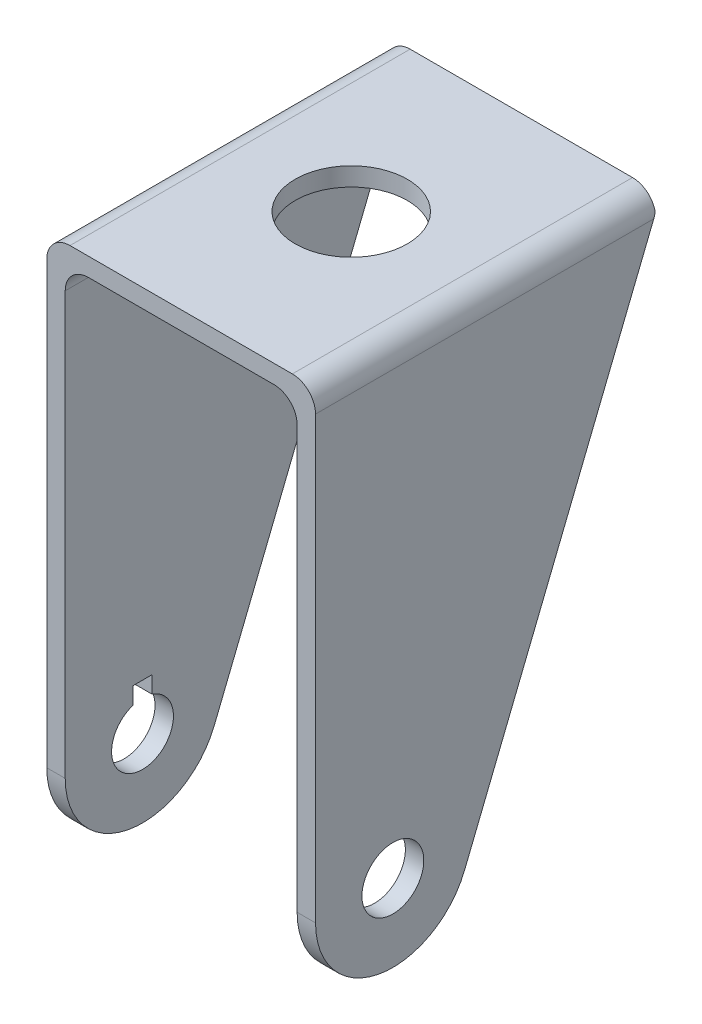
ISO-10303-21;
HEADER;
FILE_DESCRIPTION(('STEP AP214'),'2;1');
FILE_NAME('part.step','',(''),(''),'','','');
FILE_SCHEMA(('AUTOMOTIVE_DESIGN { 1 0 10303 214 1 1 1 1 }'));
ENDSEC;
DATA;
#1=APPLICATION_CONTEXT('core data for automotive mechanical design processes');
#2=APPLICATION_PROTOCOL_DEFINITION('international standard','automotive_design',2000,#1);
#3=PRODUCT_CONTEXT('',#1,'mechanical');
#4=PRODUCT('Part','Part','',(#3));
#5=PRODUCT_RELATED_PRODUCT_CATEGORY('part','',(#4));
#6=PRODUCT_DEFINITION_FORMATION('','',#4);
#7=PRODUCT_DEFINITION_CONTEXT('part definition',#1,'design');
#8=PRODUCT_DEFINITION('design','',#6,#7);
#9=PRODUCT_DEFINITION_SHAPE('','',#8);
#10=(LENGTH_UNIT() NAMED_UNIT(*) SI_UNIT(.MILLI.,.METRE.));
#11=(NAMED_UNIT(*) PLANE_ANGLE_UNIT() SI_UNIT($,.RADIAN.));
#12=(NAMED_UNIT(*) SI_UNIT($,.STERADIAN.) SOLID_ANGLE_UNIT());
#13=UNCERTAINTY_MEASURE_WITH_UNIT(LENGTH_MEASURE(1.E-05),#10,'distance_accuracy_value','');
#14=(GEOMETRIC_REPRESENTATION_CONTEXT(3) GLOBAL_UNCERTAINTY_ASSIGNED_CONTEXT((#13)) GLOBAL_UNIT_ASSIGNED_CONTEXT((#10,
#11,#12)) REPRESENTATION_CONTEXT('',''));
#15=CARTESIAN_POINT('',(0.,0.,0.));
#16=DIRECTION('',(0.,0.,1.));
#17=DIRECTION('',(1.,0.,0.));
#18=AXIS2_PLACEMENT_3D('',#15,#16,#17);
#19=CARTESIAN_POINT('',(-15.,57.61875,10.));
#20=DIRECTION('',(0.,1.,0.));
#21=DIRECTION('',(0.,0.,1.));
#22=AXIS2_PLACEMENT_3D('',#19,#20,#21);
#23=PLANE('',#22);
#24=CARTESIAN_POINT('',(0.,57.61875,-12.));
#25=DIRECTION('',(0.,1.,0.));
#26=DIRECTION('',(0.,0.,1.));
#27=AXIS2_PLACEMENT_3D('',#24,#25,#26);
#28=CIRCLE('',#27,7.25);
#29=CARTESIAN_POINT('',(0.,57.61875,-4.75));
#30=VERTEX_POINT('',#29);
#31=EDGE_CURVE('E193',#30,#30,#28,.T.);
#32=ORIENTED_EDGE('',*,*,#31,.T.);
#33=EDGE_LOOP('',(#32));
#34=FACE_BOUND('',#33,.T.);
#35=DIRECTION('',(1.,0.,0.));
#36=VECTOR('',#35,1.);
#37=CARTESIAN_POINT('',(-15.,57.61875,10.));
#38=LINE('',#37,#36);
#39=CARTESIAN_POINT('',(-12.,57.61875,10.));
#40=VERTEX_POINT('',#39);
#41=CARTESIAN_POINT('',(12.,57.61875,10.));
#42=VERTEX_POINT('',#41);
#43=EDGE_CURVE('E240',#40,#42,#38,.T.);
#44=ORIENTED_EDGE('',*,*,#43,.F.);
#45=DIRECTION('',(0.,0.,-1.));
#46=VECTOR('',#45,1.);
#47=CARTESIAN_POINT('',(-12.,57.61875,-34.));
#48=LINE('',#47,#46);
#49=CARTESIAN_POINT('',(-12.,57.61875,-34.));
#50=VERTEX_POINT('',#49);
#51=EDGE_CURVE('E244',#40,#50,#48,.T.);
#52=ORIENTED_EDGE('',*,*,#51,.T.);
#53=DIRECTION('',(1.,0.,0.));
#54=VECTOR('',#53,1.);
#55=CARTESIAN_POINT('',(-15.,57.61875,-34.));
#56=LINE('',#55,#54);
#57=CARTESIAN_POINT('',(12.,57.61875,-34.));
#58=VERTEX_POINT('',#57);
#59=EDGE_CURVE('E232',#50,#58,#56,.T.);
#60=ORIENTED_EDGE('',*,*,#59,.T.);
#61=DIRECTION('',(0.,0.,-1.));
#62=VECTOR('',#61,1.);
#63=CARTESIAN_POINT('',(12.,57.61875,10.));
#64=LINE('',#63,#62);
#65=EDGE_CURVE('E242',#58,#42,#64,.F.);
#66=ORIENTED_EDGE('',*,*,#65,.T.);
#67=EDGE_LOOP('',(#44,#52,#60,#66));
#68=FACE_BOUND('',#67,.T.);
#69=ADVANCED_FACE('F40',(#34,#68),#23,.F.);
#70=CARTESIAN_POINT('',(-15.,60.,10.));
#71=DIRECTION('',(0.,-1.,0.));
#72=DIRECTION('',(0.,0.,-1.));
#73=AXIS2_PLACEMENT_3D('',#70,#71,#72);
#74=PLANE('',#73);
#75=CARTESIAN_POINT('',(0.,60.,-12.));
#76=DIRECTION('',(0.,1.,0.));
#77=DIRECTION('',(0.,0.,1.));
#78=AXIS2_PLACEMENT_3D('',#75,#76,#77);
#79=CIRCLE('',#78,7.25);
#80=CARTESIAN_POINT('',(0.,60.,-4.75));
#81=VERTEX_POINT('',#80);
#82=EDGE_CURVE('E484',#81,#81,#79,.T.);
#83=ORIENTED_EDGE('',*,*,#82,.F.);
#84=EDGE_LOOP('',(#83));
#85=FACE_BOUND('',#84,.T.);
#86=DIRECTION('',(-1.,0.,0.));
#87=VECTOR('',#86,1.);
#88=CARTESIAN_POINT('',(-15.,60.,-34.));
#89=LINE('',#88,#87);
#90=CARTESIAN_POINT('',(14.38125,60.,-34.));
#91=VERTEX_POINT('',#90);
#92=CARTESIAN_POINT('',(-14.38125,60.,-34.));
#93=VERTEX_POINT('',#92);
#94=EDGE_CURVE('E233',#91,#93,#89,.T.);
#95=ORIENTED_EDGE('',*,*,#94,.T.);
#96=DIRECTION('',(0.,0.,1.));
#97=VECTOR('',#96,1.);
#98=CARTESIAN_POINT('',(-14.38125,60.,10.));
#99=LINE('',#98,#97);
#100=CARTESIAN_POINT('',(-14.38125,60.,10.));
#101=VERTEX_POINT('',#100);
#102=EDGE_CURVE('E252',#93,#101,#99,.T.);
#103=ORIENTED_EDGE('',*,*,#102,.T.);
#104=DIRECTION('',(-1.,0.,0.));
#105=VECTOR('',#104,1.);
#106=CARTESIAN_POINT('',(-15.,60.,10.));
#107=LINE('',#106,#105);
#108=CARTESIAN_POINT('',(14.38125,60.,10.));
#109=VERTEX_POINT('',#108);
#110=EDGE_CURVE('E238',#109,#101,#107,.T.);
#111=ORIENTED_EDGE('',*,*,#110,.F.);
#112=DIRECTION('',(0.,0.,1.));
#113=VECTOR('',#112,1.);
#114=CARTESIAN_POINT('',(14.38125,60.,-34.));
#115=LINE('',#114,#113);
#116=EDGE_CURVE('E250',#109,#91,#115,.F.);
#117=ORIENTED_EDGE('',*,*,#116,.T.);
#118=EDGE_LOOP('',(#95,#103,#111,#117));
#119=FACE_BOUND('',#118,.T.);
#120=ADVANCED_FACE('F315',(#85,#119),#74,.F.);
#121=CARTESIAN_POINT('',(0.,0.,10.));
#122=DIRECTION('',(0.,0.,1.));
#123=DIRECTION('',(1.,0.,0.));
#124=AXIS2_PLACEMENT_3D('',#121,#122,#123);
#125=PLANE('',#124);
#126=ORIENTED_EDGE('',*,*,#110,.T.);
#127=CARTESIAN_POINT('',(-14.38125,57.,10.));
#128=DIRECTION('',(0.,0.,1.));
#129=DIRECTION('',(1.,0.,0.));
#130=AXIS2_PLACEMENT_3D('',#127,#128,#129);
#131=CIRCLE('',#130,3.);
#132=CARTESIAN_POINT('',(-17.38125,57.,10.));
#133=VERTEX_POINT('',#132);
#134=EDGE_CURVE('E260',#101,#133,#131,.T.);
#135=ORIENTED_EDGE('',*,*,#134,.T.);
#136=DIRECTION('',(0.,-1.,0.));
#137=VECTOR('',#136,1.);
#138=CARTESIAN_POINT('',(-17.38125,0.,10.));
#139=LINE('',#138,#137);
#140=CARTESIAN_POINT('',(-17.38125,0.,10.));
#141=VERTEX_POINT('',#140);
#142=EDGE_CURVE('E200',#133,#141,#139,.T.);
#143=ORIENTED_EDGE('',*,*,#142,.T.);
#144=DIRECTION('',(1.,0.,0.));
#145=VECTOR('',#144,1.);
#146=CARTESIAN_POINT('',(-17.38125,0.,10.));
#147=LINE('',#146,#145);
#148=CARTESIAN_POINT('',(-15.,0.,10.));
#149=VERTEX_POINT('',#148);
#150=EDGE_CURVE('E180',#141,#149,#147,.T.);
#151=ORIENTED_EDGE('',*,*,#150,.T.);
#152=DIRECTION('',(0.,-1.,0.));
#153=VECTOR('',#152,1.);
#154=CARTESIAN_POINT('',(-15.,0.,10.));
#155=LINE('',#154,#153);
#156=CARTESIAN_POINT('',(-15.,54.61875,10.));
#157=VERTEX_POINT('',#156);
#158=EDGE_CURVE('E191',#157,#149,#155,.T.);
#159=ORIENTED_EDGE('',*,*,#158,.F.);
#160=CARTESIAN_POINT('',(-12.,54.61875,10.));
#161=DIRECTION('',(0.,0.,1.));
#162=DIRECTION('',(1.,0.,0.));
#163=AXIS2_PLACEMENT_3D('',#160,#161,#162);
#164=CIRCLE('',#163,3.);
#165=EDGE_CURVE('E280',#157,#40,#164,.F.);
#166=ORIENTED_EDGE('',*,*,#165,.T.);
#167=ORIENTED_EDGE('',*,*,#43,.T.);
#168=CARTESIAN_POINT('',(12.,54.61875,10.));
#169=DIRECTION('',(0.,0.,1.));
#170=DIRECTION('',(1.,0.,0.));
#171=AXIS2_PLACEMENT_3D('',#168,#169,#170);
#172=CIRCLE('',#171,3.);
#173=CARTESIAN_POINT('',(15.,54.61875,10.));
#174=VERTEX_POINT('',#173);
#175=EDGE_CURVE('E11',#42,#174,#172,.F.);
#176=ORIENTED_EDGE('',*,*,#175,.T.);
#177=DIRECTION('',(0.,-1.,0.));
#178=VECTOR('',#177,1.);
#179=CARTESIAN_POINT('',(15.,0.,10.));
#180=LINE('',#179,#178);
#181=CARTESIAN_POINT('',(15.,0.,10.));
#182=VERTEX_POINT('',#181);
#183=EDGE_CURVE('E202',#174,#182,#180,.T.);
#184=ORIENTED_EDGE('',*,*,#183,.T.);
#185=DIRECTION('',(-1.,0.,0.));
#186=VECTOR('',#185,1.);
#187=CARTESIAN_POINT('',(17.38125,0.,10.));
#188=LINE('',#187,#186);
#189=CARTESIAN_POINT('',(17.38125,0.,10.));
#190=VERTEX_POINT('',#189);
#191=EDGE_CURVE('E228',#190,#182,#188,.T.);
#192=ORIENTED_EDGE('',*,*,#191,.F.);
#193=DIRECTION('',(0.,-1.,0.));
#194=VECTOR('',#193,1.);
#195=CARTESIAN_POINT('',(17.38125,0.,10.));
#196=LINE('',#195,#194);
#197=CARTESIAN_POINT('',(17.38125,57.,10.));
#198=VERTEX_POINT('',#197);
#199=EDGE_CURVE('E206',#198,#190,#196,.T.);
#200=ORIENTED_EDGE('',*,*,#199,.F.);
#201=CARTESIAN_POINT('',(14.38125,57.,10.));
#202=DIRECTION('',(0.,0.,1.));
#203=DIRECTION('',(1.,0.,0.));
#204=AXIS2_PLACEMENT_3D('',#201,#202,#203);
#205=CIRCLE('',#204,3.);
#206=EDGE_CURVE('E254',#198,#109,#205,.T.);
#207=ORIENTED_EDGE('',*,*,#206,.T.);
#208=EDGE_LOOP('',(#126,#135,#143,#151,#159,#166,#167,#176,#184,#192,#200,#207));
#209=FACE_BOUND('',#208,.T.);
#210=ADVANCED_FACE('F295',(#209),#125,.T.);
#211=CARTESIAN_POINT('',(0.,0.,-34.));
#212=DIRECTION('',(0.,0.,1.));
#213=DIRECTION('',(1.,0.,0.));
#214=AXIS2_PLACEMENT_3D('',#211,#212,#213);
#215=PLANE('',#214);
#216=DIRECTION('',(1.,0.,0.));
#217=VECTOR('',#216,1.);
#218=CARTESIAN_POINT('',(-17.38125,57.61875,-34.));
#219=LINE('',#218,#217);
#220=CARTESIAN_POINT('',(-17.3167479879911,57.61875,-34.));
#221=VERTEX_POINT('',#220);
#222=EDGE_CURVE('E201',#221,#50,#219,.T.);
#223=ORIENTED_EDGE('',*,*,#222,.F.);
#224=CARTESIAN_POINT('',(-14.38125,57.,-34.));
#225=DIRECTION('',(0.,0.,1.));
#226=DIRECTION('',(1.,0.,0.));
#227=AXIS2_PLACEMENT_3D('',#224,#225,#226);
#228=CIRCLE('',#227,3.);
#229=EDGE_CURVE('E264',#221,#93,#228,.F.);
#230=ORIENTED_EDGE('',*,*,#229,.T.);
#231=ORIENTED_EDGE('',*,*,#94,.F.);
#232=CARTESIAN_POINT('',(14.38125,57.,-34.));
#233=DIRECTION('',(0.,0.,1.));
#234=DIRECTION('',(1.,0.,0.));
#235=AXIS2_PLACEMENT_3D('',#232,#233,#234);
#236=CIRCLE('',#235,3.);
#237=CARTESIAN_POINT('',(17.3167479879911,57.61875,-34.));
#238=VERTEX_POINT('',#237);
#239=EDGE_CURVE('E263',#91,#238,#236,.F.);
#240=ORIENTED_EDGE('',*,*,#239,.T.);
#241=DIRECTION('',(-1.,0.,0.));
#242=VECTOR('',#241,1.);
#243=CARTESIAN_POINT('',(17.38125,57.61875,-34.));
#244=LINE('',#243,#242);
#245=EDGE_CURVE('E58',#238,#58,#244,.T.);
#246=ORIENTED_EDGE('',*,*,#245,.T.);
#247=ORIENTED_EDGE('',*,*,#59,.F.);
#248=EDGE_LOOP('',(#223,#230,#231,#240,#246,#247));
#249=FACE_BOUND('',#248,.T.);
#250=ADVANCED_FACE('F301',(#249),#215,.F.);
#251=CARTESIAN_POINT('',(15.,0.,0.));
#252=DIRECTION('',(1.,0.,0.));
#253=DIRECTION('',(0.,0.,-1.));
#254=AXIS2_PLACEMENT_3D('',#251,#252,#253);
#255=PLANE('',#254);
#256=CARTESIAN_POINT('',(15.,0.,0.));
#257=DIRECTION('',(1.,0.,0.));
#258=DIRECTION('',(0.,0.,-1.));
#259=AXIS2_PLACEMENT_3D('',#256,#257,#258);
#260=CIRCLE('',#259,4.);
#261=CARTESIAN_POINT('',(15.,0.,4.));
#262=VERTEX_POINT('',#261);
#263=EDGE_CURVE('E207',#262,#262,#260,.T.);
#264=ORIENTED_EDGE('',*,*,#263,.T.);
#265=EDGE_LOOP('',(#264));
#266=FACE_BOUND('',#265,.T.);
#267=ORIENTED_EDGE('',*,*,#183,.F.);
#268=DIRECTION('',(0.,0.,-1.));
#269=VECTOR('',#268,1.);
#270=CARTESIAN_POINT('',(15.,54.61875,-34.));
#271=LINE('',#270,#269);
#272=CARTESIAN_POINT('',(15.,54.61875,-32.7910911182408));
#273=VERTEX_POINT('',#272);
#274=EDGE_CURVE('E270',#174,#273,#271,.T.);
#275=ORIENTED_EDGE('',*,*,#274,.T.);
#276=DIRECTION('',(0.,-0.927523861482739,0.373763944730025));
#277=VECTOR('',#276,1.);
#278=CARTESIAN_POINT('',(15.,-3.73763944730025,-9.2752386148274));
#279=LINE('',#278,#277);
#280=CARTESIAN_POINT('',(15.,-3.73763944730025,-9.2752386148274));
#281=VERTEX_POINT('',#280);
#282=EDGE_CURVE('E222',#273,#281,#279,.T.);
#283=ORIENTED_EDGE('',*,*,#282,.T.);
#284=CARTESIAN_POINT('',(15.,0.,0.));
#285=DIRECTION('',(1.,0.,0.));
#286=DIRECTION('',(0.,0.,-1.));
#287=AXIS2_PLACEMENT_3D('',#284,#285,#286);
#288=CIRCLE('',#287,10.);
#289=EDGE_CURVE('E217',#182,#281,#288,.T.);
#290=ORIENTED_EDGE('',*,*,#289,.F.);
#291=EDGE_LOOP('',(#267,#275,#283,#290));
#292=FACE_BOUND('',#291,.T.);
#293=ADVANCED_FACE('F329',(#266,#292),#255,.F.);
#294=CARTESIAN_POINT('',(17.38125,0.,0.));
#295=DIRECTION('',(-1.,0.,0.));
#296=DIRECTION('',(0.,0.,1.));
#297=AXIS2_PLACEMENT_3D('',#294,#295,#296);
#298=CYLINDRICAL_SURFACE('',#297,10.);
#299=ORIENTED_EDGE('',*,*,#289,.T.);
#300=DIRECTION('',(-1.,0.,0.));
#301=VECTOR('',#300,1.);
#302=CARTESIAN_POINT('',(17.38125,-3.73763944730025,-9.2752386148274));
#303=LINE('',#302,#301);
#304=CARTESIAN_POINT('',(17.38125,-3.73763944730025,-9.2752386148274));
#305=VERTEX_POINT('',#304);
#306=EDGE_CURVE('E226',#305,#281,#303,.T.);
#307=ORIENTED_EDGE('',*,*,#306,.F.);
#308=CARTESIAN_POINT('',(17.38125,0.,0.));
#309=DIRECTION('',(1.,0.,0.));
#310=DIRECTION('',(0.,0.,-1.));
#311=AXIS2_PLACEMENT_3D('',#308,#309,#310);
#312=CIRCLE('',#311,10.);
#313=EDGE_CURVE('E208',#190,#305,#312,.T.);
#314=ORIENTED_EDGE('',*,*,#313,.F.);
#315=ORIENTED_EDGE('',*,*,#191,.T.);
#316=EDGE_LOOP('',(#299,#307,#314,#315));
#317=FACE_BOUND('',#316,.T.);
#318=ADVANCED_FACE('F327',(#317),#298,.T.);
#319=CARTESIAN_POINT('',(17.38125,-3.73763944730025,-9.2752386148274));
#320=DIRECTION('',(0.,-0.373763944730025,-0.927523861482739));
#321=DIRECTION('',(0.,0.927523861482739,-0.373763944730025));
#322=AXIS2_PLACEMENT_3D('',#319,#320,#321);
#323=PLANE('',#322);
#324=ORIENTED_EDGE('',*,*,#245,.F.);
#325=CARTESIAN_POINT('',(14.38125,57.,-33.7506625431372));
#326=DIRECTION('',(0.,-0.373763944730025,-0.927523861482739));
#327=DIRECTION('',(0.,0.927523861482739,-0.373763944730025));
#328=AXIS2_PLACEMENT_3D('',#325,#326,#327);
#329=ELLIPSE('',#328,3.2344181369137,3.);
#330=CARTESIAN_POINT('',(17.38125,57.,-33.7506625431372));
#331=VERTEX_POINT('',#330);
#332=EDGE_CURVE('E272',#238,#331,#329,.T.);
#333=ORIENTED_EDGE('',*,*,#332,.T.);
#334=DIRECTION('',(0.,-0.927523861482739,0.373763944730025));
#335=VECTOR('',#334,1.);
#336=CARTESIAN_POINT('',(17.38125,-3.73763944730025,-9.2752386148274));
#337=LINE('',#336,#335);
#338=EDGE_CURVE('E215',#331,#305,#337,.T.);
#339=ORIENTED_EDGE('',*,*,#338,.T.);
#340=ORIENTED_EDGE('',*,*,#306,.T.);
#341=ORIENTED_EDGE('',*,*,#282,.F.);
#342=CARTESIAN_POINT('',(12.,54.61875,-32.7910911182408));
#343=DIRECTION('',(0.,-0.373763944730025,-0.927523861482739));
#344=DIRECTION('',(0.,-0.927523861482739,0.373763944730025));
#345=AXIS2_PLACEMENT_3D('',#342,#343,#344);
#346=ELLIPSE('',#345,3.2344181369137,3.);
#347=EDGE_CURVE('E44',#273,#58,#346,.F.);
#348=ORIENTED_EDGE('',*,*,#347,.T.);
#349=EDGE_LOOP('',(#324,#333,#339,#340,#341,#348));
#350=FACE_BOUND('',#349,.T.);
#351=ADVANCED_FACE('F285',(#350),#323,.T.);
#352=CARTESIAN_POINT('',(17.38125,0.,0.));
#353=DIRECTION('',(-1.,0.,0.));
#354=DIRECTION('',(0.,0.,1.));
#355=AXIS2_PLACEMENT_3D('',#352,#353,#354);
#356=CYLINDRICAL_SURFACE('',#355,4.);
#357=CARTESIAN_POINT('',(17.38125,0.,0.));
#358=DIRECTION('',(1.,0.,0.));
#359=DIRECTION('',(0.,0.,-1.));
#360=AXIS2_PLACEMENT_3D('',#357,#358,#359);
#361=CIRCLE('',#360,4.);
#362=CARTESIAN_POINT('',(17.38125,0.,4.));
#363=VERTEX_POINT('',#362);
#364=EDGE_CURVE('E212',#363,#363,#361,.T.);
#365=CARTESIAN_POINT('',(17.38125,0.,4.));
#366=CARTESIAN_POINT('',(17.3564453125,0.,4.));
#367=CARTESIAN_POINT('',(17.331640625,0.,4.));
#368=CARTESIAN_POINT('',(17.28203125,0.,4.));
#369=CARTESIAN_POINT('',(17.2572265625,0.,4.));
#370=CARTESIAN_POINT('',(17.2076171875,0.,4.));
#371=CARTESIAN_POINT('',(17.1828125,0.,4.));
#372=CARTESIAN_POINT('',(17.133203125,0.,4.));
#373=CARTESIAN_POINT('',(17.1083984375,0.,4.));
#374=CARTESIAN_POINT('',(17.0587890625,0.,4.));
#375=CARTESIAN_POINT('',(17.033984375,0.,4.));
#376=CARTESIAN_POINT('',(16.984375,0.,4.));
#377=CARTESIAN_POINT('',(16.9595703125,0.,4.));
#378=CARTESIAN_POINT('',(16.9099609375,0.,4.));
#379=CARTESIAN_POINT('',(16.88515625,0.,4.));
#380=CARTESIAN_POINT('',(16.835546875,0.,4.));
#381=CARTESIAN_POINT('',(16.8107421875,0.,4.));
#382=CARTESIAN_POINT('',(16.7611328125,0.,4.));
#383=CARTESIAN_POINT('',(16.736328125,0.,4.));
#384=CARTESIAN_POINT('',(16.68671875,0.,4.));
#385=CARTESIAN_POINT('',(16.6619140625,0.,4.));
#386=CARTESIAN_POINT('',(16.6123046875,0.,4.));
#387=CARTESIAN_POINT('',(16.5875,0.,4.));
#388=CARTESIAN_POINT('',(16.537890625,0.,4.));
#389=CARTESIAN_POINT('',(16.5130859375,0.,4.));
#390=CARTESIAN_POINT('',(16.4634765625,0.,4.));
#391=CARTESIAN_POINT('',(16.438671875,0.,4.));
#392=CARTESIAN_POINT('',(16.3890625,0.,4.));
#393=CARTESIAN_POINT('',(16.3642578125,0.,4.));
#394=CARTESIAN_POINT('',(16.3146484375,0.,4.));
#395=CARTESIAN_POINT('',(16.28984375,0.,4.));
#396=CARTESIAN_POINT('',(16.240234375,0.,4.));
#397=CARTESIAN_POINT('',(16.2154296875,0.,4.));
#398=CARTESIAN_POINT('',(16.1658203125,0.,4.));
#399=CARTESIAN_POINT('',(16.141015625,0.,4.));
#400=CARTESIAN_POINT('',(16.09140625,0.,4.));
#401=CARTESIAN_POINT('',(16.0666015625,0.,4.));
#402=CARTESIAN_POINT('',(16.0169921875,0.,4.));
#403=CARTESIAN_POINT('',(15.9921875,0.,4.));
#404=CARTESIAN_POINT('',(15.942578125,0.,4.));
#405=CARTESIAN_POINT('',(15.9177734375,0.,4.));
#406=CARTESIAN_POINT('',(15.8681640625,0.,4.));
#407=CARTESIAN_POINT('',(15.843359375,0.,4.));
#408=CARTESIAN_POINT('',(15.79375,0.,4.));
#409=CARTESIAN_POINT('',(15.7689453125,0.,4.));
#410=CARTESIAN_POINT('',(15.7193359375,0.,4.));
#411=CARTESIAN_POINT('',(15.69453125,0.,4.));
#412=CARTESIAN_POINT('',(15.644921875,0.,4.));
#413=CARTESIAN_POINT('',(15.6201171875,0.,4.));
#414=CARTESIAN_POINT('',(15.5705078125,0.,4.));
#415=CARTESIAN_POINT('',(15.545703125,0.,4.));
#416=CARTESIAN_POINT('',(15.49609375,0.,4.));
#417=CARTESIAN_POINT('',(15.4712890625,0.,4.));
#418=CARTESIAN_POINT('',(15.4216796875,0.,4.));
#419=CARTESIAN_POINT('',(15.396875,0.,4.));
#420=CARTESIAN_POINT('',(15.347265625,0.,4.));
#421=CARTESIAN_POINT('',(15.3224609375,0.,4.));
#422=CARTESIAN_POINT('',(15.2728515625,0.,4.));
#423=CARTESIAN_POINT('',(15.248046875,0.,4.));
#424=CARTESIAN_POINT('',(15.1984375,0.,4.));
#425=CARTESIAN_POINT('',(15.1736328125,0.,4.));
#426=CARTESIAN_POINT('',(15.1240234375,0.,4.));
#427=CARTESIAN_POINT('',(15.09921875,0.,4.));
#428=CARTESIAN_POINT('',(15.049609375,0.,4.));
#429=CARTESIAN_POINT('',(15.0248046875,0.,4.));
#430=CARTESIAN_POINT('',(15.,0.,4.));
#431=B_SPLINE_CURVE_WITH_KNOTS('',3,(#365,#366,#367,#368,#369,#370,#371,#372,#373,#374,#375,
#376,#377,#378,#379,#380,#381,#382,#383,#384,#385,#386,#387,#388,#389,#390,#391,#392,#393,#394,
#395,#396,#397,#398,#399,#400,#401,#402,#403,#404,#405,#406,#407,#408,#409,#410,#411,#412,#413,
#414,#415,#416,#417,#418,#419,#420,#421,#422,#423,#424,#425,#426,#427,#428,#429,#430),
.UNSPECIFIED.,.F.,.F.,(4,2,2,2,2,2,2,2,2,2,2,2,2,2,2,2,2,2,2,2,2,2,2,2,2,2,2,2,2,2,2,2,4),(0.,
0.0744140624999966,0.148828124999997,0.223242187499997,0.297656249999997,0.372070312499997,
0.446484374999997,0.520898437499997,0.595312499999997,0.669726562499997,0.744140624999997,
0.818554687499997,0.892968749999997,0.967382812499997,1.041796875,1.1162109375,1.190625,
1.2650390625,1.339453125,1.4138671875,1.48828125,1.5626953125,1.637109375,1.7115234375,
1.7859375,1.8603515625,1.934765625,2.0091796875,2.08359375,2.1580078125,2.232421875,
2.3068359375,2.38125),.UNSPECIFIED.);
#432=EDGE_CURVE('BSEAM392',#363,#262,#431,.T.);
#433=ORIENTED_EDGE('',*,*,#364,.T.);
#434=ORIENTED_EDGE('',*,*,#263,.F.);
#435=ORIENTED_EDGE('',*,*,#432,.T.);
#436=ORIENTED_EDGE('',*,*,#432,.F.);
#437=EDGE_LOOP('',(#433,#435,#434,#436));
#438=FACE_BOUND('',#437,.T.);
#439=ADVANCED_FACE('F392',(#438),#356,.F.);
#440=CARTESIAN_POINT('',(17.38125,0.,0.));
#441=DIRECTION('',(1.,0.,0.));
#442=DIRECTION('',(0.,0.,-1.));
#443=AXIS2_PLACEMENT_3D('',#440,#441,#442);
#444=PLANE('',#443);
#445=ORIENTED_EDGE('',*,*,#338,.F.);
#446=DIRECTION('',(0.,0.,1.));
#447=VECTOR('',#446,1.);
#448=CARTESIAN_POINT('',(17.38125,57.,10.));
#449=LINE('',#448,#447);
#450=EDGE_CURVE('E269',#331,#198,#449,.T.);
#451=ORIENTED_EDGE('',*,*,#450,.T.);
#452=ORIENTED_EDGE('',*,*,#199,.T.);
#453=ORIENTED_EDGE('',*,*,#313,.T.);
#454=EDGE_LOOP('',(#445,#451,#452,#453));
#455=FACE_BOUND('',#454,.T.);
#456=ORIENTED_EDGE('',*,*,#364,.F.);
#457=EDGE_LOOP('',(#456));
#458=FACE_BOUND('',#457,.T.);
#459=ADVANCED_FACE('F325',(#455,#458),#444,.T.);
#460=CARTESIAN_POINT('',(-17.38125,-3.73763944730025,-9.2752386148274));
#461=DIRECTION('',(0.,0.373763944730025,0.927523861482739));
#462=DIRECTION('',(0.,-0.927523861482739,0.373763944730025));
#463=AXIS2_PLACEMENT_3D('',#460,#461,#462);
#464=PLANE('',#463);
#465=DIRECTION('',(0.,-0.927523861482739,0.373763944730025));
#466=VECTOR('',#465,1.);
#467=CARTESIAN_POINT('',(-17.38125,-3.73763944730025,-9.2752386148274));
#468=LINE('',#467,#466);
#469=CARTESIAN_POINT('',(-17.38125,57.,-33.7506625431372));
#470=VERTEX_POINT('',#469);
#471=CARTESIAN_POINT('',(-17.38125,-3.73763944730025,-9.2752386148274));
#472=VERTEX_POINT('',#471);
#473=EDGE_CURVE('E190',#470,#472,#468,.T.);
#474=ORIENTED_EDGE('',*,*,#473,.F.);
#475=CARTESIAN_POINT('',(-14.38125,57.,-33.7506625431372));
#476=DIRECTION('',(0.,0.373763944730025,0.927523861482739));
#477=DIRECTION('',(0.,0.927523861482739,-0.373763944730025));
#478=AXIS2_PLACEMENT_3D('',#475,#476,#477);
#479=ELLIPSE('',#478,3.2344181369137,3.);
#480=EDGE_CURVE('E261',#470,#221,#479,.F.);
#481=ORIENTED_EDGE('',*,*,#480,.T.);
#482=ORIENTED_EDGE('',*,*,#222,.T.);
#483=CARTESIAN_POINT('',(-12.,54.61875,-32.7910911182408));
#484=DIRECTION('',(0.,0.373763944730025,0.927523861482739));
#485=DIRECTION('',(0.,-0.927523861482739,0.373763944730025));
#486=AXIS2_PLACEMENT_3D('',#483,#484,#485);
#487=ELLIPSE('',#486,3.2344181369137,3.);
#488=CARTESIAN_POINT('',(-15.,54.61875,-32.7910911182408));
#489=VERTEX_POINT('',#488);
#490=EDGE_CURVE('E274',#50,#489,#487,.T.);
#491=ORIENTED_EDGE('',*,*,#490,.T.);
#492=DIRECTION('',(0.,-0.927523861482739,0.373763944730025));
#493=VECTOR('',#492,1.);
#494=CARTESIAN_POINT('',(-15.,-3.73763944730025,-9.2752386148274));
#495=LINE('',#494,#493);
#496=CARTESIAN_POINT('',(-15.,-3.73763944730025,-9.2752386148274));
#497=VERTEX_POINT('',#496);
#498=EDGE_CURVE('E194',#489,#497,#495,.T.);
#499=ORIENTED_EDGE('',*,*,#498,.T.);
#500=DIRECTION('',(1.,0.,0.));
#501=VECTOR('',#500,1.);
#502=CARTESIAN_POINT('',(-17.38125,-3.73763944730025,-9.2752386148274));
#503=LINE('',#502,#501);
#504=EDGE_CURVE('E184',#472,#497,#503,.T.);
#505=ORIENTED_EDGE('',*,*,#504,.F.);
#506=EDGE_LOOP('',(#474,#481,#482,#491,#499,#505));
#507=FACE_BOUND('',#506,.T.);
#508=ADVANCED_FACE('F386',(#507),#464,.F.);
#509=CARTESIAN_POINT('',(-17.38125,0.,0.));
#510=DIRECTION('',(1.,0.,0.));
#511=DIRECTION('',(0.,0.,-1.));
#512=AXIS2_PLACEMENT_3D('',#509,#510,#511);
#513=CYLINDRICAL_SURFACE('',#512,10.);
#514=CARTESIAN_POINT('',(-15.,0.,0.));
#515=DIRECTION('',(1.,0.,0.));
#516=DIRECTION('',(0.,0.,-1.));
#517=AXIS2_PLACEMENT_3D('',#514,#515,#516);
#518=CIRCLE('',#517,10.);
#519=EDGE_CURVE('E198',#149,#497,#518,.T.);
#520=ORIENTED_EDGE('',*,*,#519,.F.);
#521=ORIENTED_EDGE('',*,*,#150,.F.);
#522=CARTESIAN_POINT('',(-17.38125,0.,0.));
#523=DIRECTION('',(1.,0.,0.));
#524=DIRECTION('',(0.,0.,-1.));
#525=AXIS2_PLACEMENT_3D('',#522,#523,#524);
#526=CIRCLE('',#525,10.);
#527=EDGE_CURVE('E182',#141,#472,#526,.T.);
#528=ORIENTED_EDGE('',*,*,#527,.T.);
#529=ORIENTED_EDGE('',*,*,#504,.T.);
#530=EDGE_LOOP('',(#520,#521,#528,#529));
#531=FACE_BOUND('',#530,.T.);
#532=ADVANCED_FACE('F387',(#531),#513,.T.);
#533=CARTESIAN_POINT('',(-17.38125,0.,0.));
#534=DIRECTION('',(1.,0.,0.));
#535=DIRECTION('',(0.,0.,-1.));
#536=AXIS2_PLACEMENT_3D('',#533,#534,#535);
#537=CYLINDRICAL_SURFACE('',#536,4.);
#538=CARTESIAN_POINT('',(-17.38125,0.,0.));
#539=DIRECTION('',(1.,0.,0.));
#540=DIRECTION('',(0.,0.,-1.));
#541=AXIS2_PLACEMENT_3D('',#538,#539,#540);
#542=CIRCLE('',#541,4.);
#543=CARTESIAN_POINT('',(-17.38125,3.79967103839267,1.25));
#544=VERTEX_POINT('',#543);
#545=CARTESIAN_POINT('',(-17.38125,3.79967103839267,-1.25));
#546=VERTEX_POINT('',#545);
#547=EDGE_CURVE('E168',#544,#546,#542,.T.);
#548=ORIENTED_EDGE('',*,*,#547,.F.);
#549=DIRECTION('',(1.,0.,0.));
#550=VECTOR('',#549,1.);
#551=CARTESIAN_POINT('',(-17.38125,3.79967103839267,1.25));
#552=LINE('',#551,#550);
#553=CARTESIAN_POINT('',(-15.,3.79967103839267,1.25));
#554=VERTEX_POINT('',#553);
#555=EDGE_CURVE('E173',#554,#544,#552,.F.);
#556=ORIENTED_EDGE('',*,*,#555,.F.);
#557=CARTESIAN_POINT('',(-15.,0.,0.));
#558=DIRECTION('',(1.,0.,0.));
#559=DIRECTION('',(0.,0.,-1.));
#560=AXIS2_PLACEMENT_3D('',#557,#558,#559);
#561=CIRCLE('',#560,4.);
#562=CARTESIAN_POINT('',(-15.,3.79967103839267,-1.25));
#563=VERTEX_POINT('',#562);
#564=EDGE_CURVE('E175',#554,#563,#561,.T.);
#565=ORIENTED_EDGE('',*,*,#564,.T.);
#566=DIRECTION('',(1.,0.,0.));
#567=VECTOR('',#566,1.);
#568=CARTESIAN_POINT('',(-17.38125,3.79967103839267,-1.25));
#569=LINE('',#568,#567);
#570=EDGE_CURVE('E55',#546,#563,#569,.T.);
#571=ORIENTED_EDGE('',*,*,#570,.F.);
#572=EDGE_LOOP('',(#548,#556,#565,#571));
#573=FACE_BOUND('',#572,.T.);
#574=ADVANCED_FACE('F169',(#573),#537,.F.);
#575=CARTESIAN_POINT('',(-17.38125,0.,0.));
#576=DIRECTION('',(-1.,0.,0.));
#577=DIRECTION('',(0.,0.,-1.));
#578=AXIS2_PLACEMENT_3D('',#575,#576,#577);
#579=PLANE('',#578);
#580=DIRECTION('',(0.,1.,0.));
#581=VECTOR('',#580,1.);
#582=CARTESIAN_POINT('',(-17.38125,6.,1.25));
#583=LINE('',#582,#581);
#584=CARTESIAN_POINT('',(-17.38125,6.,1.25));
#585=VERTEX_POINT('',#584);
#586=EDGE_CURVE('E165',#544,#585,#583,.T.);
#587=ORIENTED_EDGE('',*,*,#586,.F.);
#588=ORIENTED_EDGE('',*,*,#547,.T.);
#589=DIRECTION('',(0.,-1.,0.));
#590=VECTOR('',#589,1.);
#591=CARTESIAN_POINT('',(-17.38125,6.,-1.25));
#592=LINE('',#591,#590);
#593=CARTESIAN_POINT('',(-17.38125,6.,-1.25));
#594=VERTEX_POINT('',#593);
#595=EDGE_CURVE('E154',#594,#546,#592,.T.);
#596=ORIENTED_EDGE('',*,*,#595,.F.);
#597=DIRECTION('',(0.,0.,-1.));
#598=VECTOR('',#597,1.);
#599=CARTESIAN_POINT('',(-17.38125,6.,-1.25));
#600=LINE('',#599,#598);
#601=EDGE_CURVE('E496',#585,#594,#600,.T.);
#602=ORIENTED_EDGE('',*,*,#601,.F.);
#603=EDGE_LOOP('',(#587,#588,#596,#602));
#604=FACE_BOUND('',#603,.T.);
#605=ORIENTED_EDGE('',*,*,#142,.F.);
#606=DIRECTION('',(0.,0.,1.));
#607=VECTOR('',#606,1.);
#608=CARTESIAN_POINT('',(-17.38125,57.,-34.));
#609=LINE('',#608,#607);
#610=EDGE_CURVE('E259',#133,#470,#609,.F.);
#611=ORIENTED_EDGE('',*,*,#610,.T.);
#612=ORIENTED_EDGE('',*,*,#473,.T.);
#613=ORIENTED_EDGE('',*,*,#527,.F.);
#614=EDGE_LOOP('',(#605,#611,#612,#613));
#615=FACE_BOUND('',#614,.T.);
#616=ADVANCED_FACE('F177',(#604,#615),#579,.T.);
#617=CARTESIAN_POINT('',(-15.,0.,0.));
#618=DIRECTION('',(-1.,0.,0.));
#619=DIRECTION('',(0.,0.,-1.));
#620=AXIS2_PLACEMENT_3D('',#617,#618,#619);
#621=PLANE('',#620);
#622=ORIENTED_EDGE('',*,*,#498,.F.);
#623=DIRECTION('',(0.,0.,-1.));
#624=VECTOR('',#623,1.);
#625=CARTESIAN_POINT('',(-15.,54.61875,10.));
#626=LINE('',#625,#624);
#627=EDGE_CURVE('E249',#489,#157,#626,.F.);
#628=ORIENTED_EDGE('',*,*,#627,.T.);
#629=ORIENTED_EDGE('',*,*,#158,.T.);
#630=ORIENTED_EDGE('',*,*,#519,.T.);
#631=EDGE_LOOP('',(#622,#628,#629,#630));
#632=FACE_BOUND('',#631,.T.);
#633=ORIENTED_EDGE('',*,*,#564,.F.);
#634=DIRECTION('',(0.,-1.,0.));
#635=VECTOR('',#634,1.);
#636=CARTESIAN_POINT('',(-15.,6.,1.25));
#637=LINE('',#636,#635);
#638=CARTESIAN_POINT('',(-15.,6.,1.25));
#639=VERTEX_POINT('',#638);
#640=EDGE_CURVE('E482',#639,#554,#637,.T.);
#641=ORIENTED_EDGE('',*,*,#640,.F.);
#642=DIRECTION('',(0.,0.,1.));
#643=VECTOR('',#642,1.);
#644=CARTESIAN_POINT('',(-15.,6.,-1.25));
#645=LINE('',#644,#643);
#646=CARTESIAN_POINT('',(-15.,6.,-1.25));
#647=VERTEX_POINT('',#646);
#648=EDGE_CURVE('E172',#647,#639,#645,.T.);
#649=ORIENTED_EDGE('',*,*,#648,.F.);
#650=DIRECTION('',(0.,1.,0.));
#651=VECTOR('',#650,1.);
#652=CARTESIAN_POINT('',(-15.,6.,-1.25));
#653=LINE('',#652,#651);
#654=EDGE_CURVE('E162',#563,#647,#653,.T.);
#655=ORIENTED_EDGE('',*,*,#654,.F.);
#656=EDGE_LOOP('',(#633,#641,#649,#655));
#657=FACE_BOUND('',#656,.T.);
#658=ADVANCED_FACE('F357',(#632,#657),#621,.F.);
#659=CARTESIAN_POINT('',(-12.,54.61875,10.));
#660=DIRECTION('',(0.,0.,1.));
#661=DIRECTION('',(1.,0.,0.));
#662=AXIS2_PLACEMENT_3D('',#659,#660,#661);
#663=CYLINDRICAL_SURFACE('',#662,3.);
#664=ORIENTED_EDGE('',*,*,#165,.F.);
#665=ORIENTED_EDGE('',*,*,#627,.F.);
#666=ORIENTED_EDGE('',*,*,#490,.F.);
#667=ORIENTED_EDGE('',*,*,#51,.F.);
#668=EDGE_LOOP('',(#664,#665,#666,#667));
#669=FACE_BOUND('',#668,.T.);
#670=ADVANCED_FACE('F297',(#669),#663,.F.);
#671=CARTESIAN_POINT('',(-14.38125,57.,10.));
#672=DIRECTION('',(0.,0.,-1.));
#673=DIRECTION('',(-1.,0.,0.));
#674=AXIS2_PLACEMENT_3D('',#671,#672,#673);
#675=CYLINDRICAL_SURFACE('',#674,3.);
#676=ORIENTED_EDGE('',*,*,#480,.F.);
#677=ORIENTED_EDGE('',*,*,#610,.F.);
#678=ORIENTED_EDGE('',*,*,#134,.F.);
#679=ORIENTED_EDGE('',*,*,#102,.F.);
#680=ORIENTED_EDGE('',*,*,#229,.F.);
#681=EDGE_LOOP('',(#676,#677,#678,#679,#680));
#682=FACE_BOUND('',#681,.T.);
#683=ADVANCED_FACE('F306',(#682),#675,.T.);
#684=CARTESIAN_POINT('',(12.,54.61875,0.));
#685=DIRECTION('',(0.,0.,1.));
#686=DIRECTION('',(1.,0.,0.));
#687=AXIS2_PLACEMENT_3D('',#684,#685,#686);
#688=CYLINDRICAL_SURFACE('',#687,3.);
#689=ORIENTED_EDGE('',*,*,#175,.F.);
#690=ORIENTED_EDGE('',*,*,#65,.F.);
#691=ORIENTED_EDGE('',*,*,#347,.F.);
#692=ORIENTED_EDGE('',*,*,#274,.F.);
#693=EDGE_LOOP('',(#689,#690,#691,#692));
#694=FACE_BOUND('',#693,.T.);
#695=ADVANCED_FACE('F287',(#694),#688,.F.);
#696=CARTESIAN_POINT('',(14.38125,57.,0.));
#697=DIRECTION('',(0.,0.,-1.));
#698=DIRECTION('',(-1.,0.,0.));
#699=AXIS2_PLACEMENT_3D('',#696,#697,#698);
#700=CYLINDRICAL_SURFACE('',#699,3.);
#701=ORIENTED_EDGE('',*,*,#239,.F.);
#702=ORIENTED_EDGE('',*,*,#116,.F.);
#703=ORIENTED_EDGE('',*,*,#206,.F.);
#704=ORIENTED_EDGE('',*,*,#450,.F.);
#705=ORIENTED_EDGE('',*,*,#332,.F.);
#706=EDGE_LOOP('',(#701,#702,#703,#704,#705));
#707=FACE_BOUND('',#706,.T.);
#708=ADVANCED_FACE('F39',(#707),#700,.T.);
#709=CARTESIAN_POINT('',(0.,-9.99999999999999,-12.));
#710=DIRECTION('',(0.,1.,0.));
#711=DIRECTION('',(0.,0.,1.));
#712=AXIS2_PLACEMENT_3D('',#709,#710,#711);
#713=CYLINDRICAL_SURFACE('',#712,7.25);
#714=ORIENTED_EDGE('',*,*,#82,.T.);
#715=EDGE_LOOP('',(#714));
#716=FACE_BOUND('',#715,.T.);
#717=ORIENTED_EDGE('',*,*,#31,.F.);
#718=EDGE_LOOP('',(#717));
#719=FACE_BOUND('',#718,.T.);
#720=ADVANCED_FACE('F362',(#716,#719),#713,.F.);
#721=CARTESIAN_POINT('',(17.38225,6.,1.25));
#722=DIRECTION('',(0.,0.,1.));
#723=DIRECTION('',(0.,-1.,0.));
#724=AXIS2_PLACEMENT_3D('',#721,#722,#723);
#725=PLANE('',#724);
#726=ORIENTED_EDGE('',*,*,#555,.T.);
#727=ORIENTED_EDGE('',*,*,#586,.T.);
#728=DIRECTION('',(-1.,0.,0.));
#729=VECTOR('',#728,1.);
#730=CARTESIAN_POINT('',(17.38225,6.,1.25));
#731=LINE('',#730,#729);
#732=EDGE_CURVE('E481',#639,#585,#731,.T.);
#733=ORIENTED_EDGE('',*,*,#732,.F.);
#734=ORIENTED_EDGE('',*,*,#640,.T.);
#735=EDGE_LOOP('',(#726,#727,#733,#734));
#736=FACE_BOUND('',#735,.T.);
#737=ADVANCED_FACE('F368',(#736),#725,.F.);
#738=CARTESIAN_POINT('',(17.38225,6.,-1.25));
#739=DIRECTION('',(0.,1.,0.));
#740=DIRECTION('',(0.,0.,1.));
#741=AXIS2_PLACEMENT_3D('',#738,#739,#740);
#742=PLANE('',#741);
#743=ORIENTED_EDGE('',*,*,#648,.T.);
#744=ORIENTED_EDGE('',*,*,#732,.T.);
#745=ORIENTED_EDGE('',*,*,#601,.T.);
#746=DIRECTION('',(-1.,0.,0.));
#747=VECTOR('',#746,1.);
#748=CARTESIAN_POINT('',(17.38225,6.,-1.25));
#749=LINE('',#748,#747);
#750=EDGE_CURVE('E160',#647,#594,#749,.T.);
#751=ORIENTED_EDGE('',*,*,#750,.F.);
#752=EDGE_LOOP('',(#743,#744,#745,#751));
#753=FACE_BOUND('',#752,.T.);
#754=ADVANCED_FACE('F373',(#753),#742,.F.);
#755=CARTESIAN_POINT('',(17.38225,6.,-1.25));
#756=DIRECTION('',(0.,0.,-1.));
#757=DIRECTION('',(0.,1.,0.));
#758=AXIS2_PLACEMENT_3D('',#755,#756,#757);
#759=PLANE('',#758);
#760=ORIENTED_EDGE('',*,*,#570,.T.);
#761=ORIENTED_EDGE('',*,*,#654,.T.);
#762=ORIENTED_EDGE('',*,*,#750,.T.);
#763=ORIENTED_EDGE('',*,*,#595,.T.);
#764=EDGE_LOOP('',(#760,#761,#762,#763));
#765=FACE_BOUND('',#764,.T.);
#766=ADVANCED_FACE('F156',(#765),#759,.F.);
#767=CLOSED_SHELL('',(#69,#120,#210,#250,#293,#318,#351,#439,#459,#508,#532,#574,#616,#658,#670,
#683,#695,#708,#720,#737,#754,#766));
#768=MANIFOLD_SOLID_BREP('B2',#767);
#769=ADVANCED_BREP_SHAPE_REPRESENTATION('',(#18,#768),#14);
#770=SHAPE_DEFINITION_REPRESENTATION(#9,#769);
ENDSEC;
END-ISO-10303-21;
